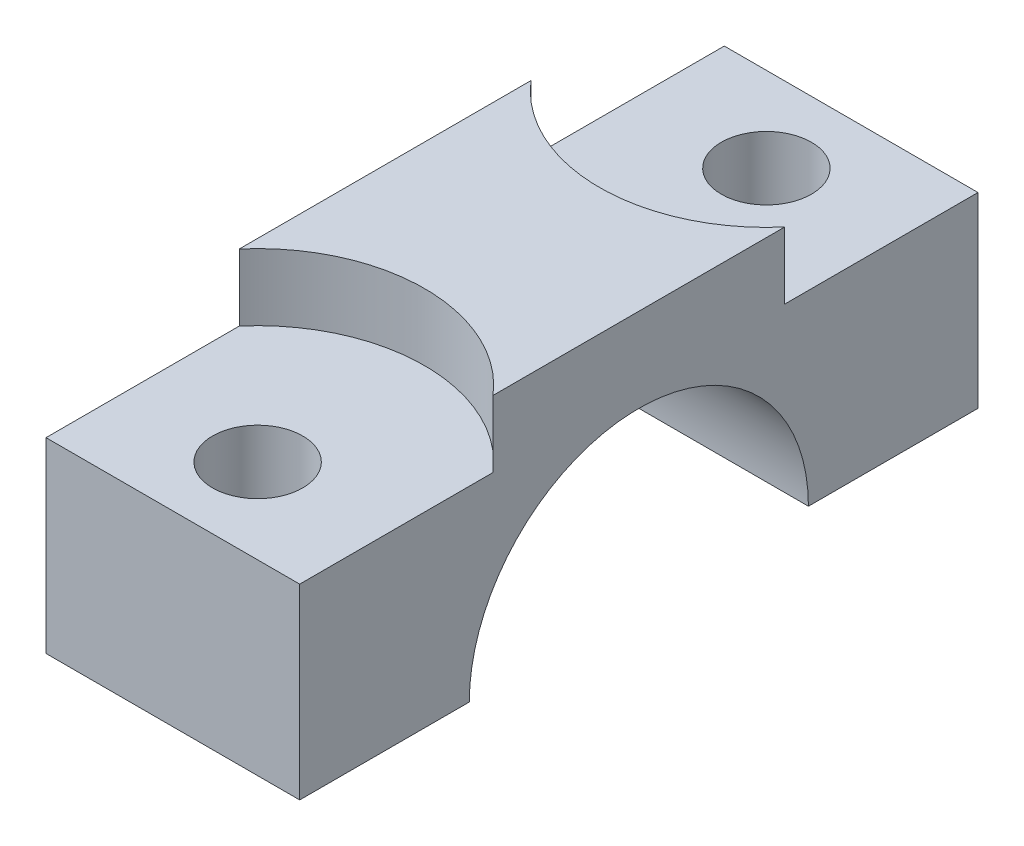
ISO-10303-21;
HEADER;
FILE_DESCRIPTION(('STEP AP214'),'2;1');
FILE_NAME('part.step','',(''),(''),'','','');
FILE_SCHEMA(('AUTOMOTIVE_DESIGN { 1 0 10303 214 1 1 1 1 }'));
ENDSEC;
DATA;
#1=APPLICATION_CONTEXT('core data for automotive mechanical design processes');
#2=APPLICATION_PROTOCOL_DEFINITION('international standard','automotive_design',2000,#1);
#3=PRODUCT_CONTEXT('',#1,'mechanical');
#4=PRODUCT('Part','Part','',(#3));
#5=PRODUCT_RELATED_PRODUCT_CATEGORY('part','',(#4));
#6=PRODUCT_DEFINITION_FORMATION('','',#4);
#7=PRODUCT_DEFINITION_CONTEXT('part definition',#1,'design');
#8=PRODUCT_DEFINITION('design','',#6,#7);
#9=PRODUCT_DEFINITION_SHAPE('','',#8);
#10=(LENGTH_UNIT() NAMED_UNIT(*) SI_UNIT(.MILLI.,.METRE.));
#11=(NAMED_UNIT(*) PLANE_ANGLE_UNIT() SI_UNIT($,.RADIAN.));
#12=(NAMED_UNIT(*) SI_UNIT($,.STERADIAN.) SOLID_ANGLE_UNIT());
#13=UNCERTAINTY_MEASURE_WITH_UNIT(LENGTH_MEASURE(1.E-05),#10,'distance_accuracy_value','');
#14=(GEOMETRIC_REPRESENTATION_CONTEXT(3) GLOBAL_UNCERTAINTY_ASSIGNED_CONTEXT((#13)) GLOBAL_UNIT_ASSIGNED_CONTEXT((#10,
#11,#12)) REPRESENTATION_CONTEXT('',''));
#15=CARTESIAN_POINT('',(0.,0.,0.));
#16=DIRECTION('',(0.,0.,1.));
#17=DIRECTION('',(1.,0.,0.));
#18=AXIS2_PLACEMENT_3D('',#15,#16,#17);
#19=CARTESIAN_POINT('',(9.5,19.,25.4));
#20=DIRECTION('',(0.,-1.,0.));
#21=DIRECTION('',(0.,0.,-1.));
#22=AXIS2_PLACEMENT_3D('',#19,#20,#21);
#23=PLANE('',#22);
#24=CARTESIAN_POINT('',(0.,19.,-19.05));
#25=DIRECTION('',(0.,1.,0.));
#26=DIRECTION('',(0.,0.,1.));
#27=AXIS2_PLACEMENT_3D('',#24,#25,#26);
#28=CIRCLE('',#27,12.5);
#29=CARTESIAN_POINT('',(-9.5,19.,-10.925961595364));
#30=VERTEX_POINT('',#29);
#31=CARTESIAN_POINT('',(9.5,19.,-10.925961595364));
#32=VERTEX_POINT('',#31);
#33=EDGE_CURVE('E118',#30,#32,#28,.T.);
#34=ORIENTED_EDGE('',*,*,#33,.F.);
#35=DIRECTION('',(0.,0.,1.));
#36=VECTOR('',#35,1.);
#37=CARTESIAN_POINT('',(-9.5,19.,25.4));
#38=LINE('',#37,#36);
#39=CARTESIAN_POINT('',(-9.5,19.,10.925961595364));
#40=VERTEX_POINT('',#39);
#41=EDGE_CURVE('E171',#30,#40,#38,.T.);
#42=ORIENTED_EDGE('',*,*,#41,.T.);
#43=CARTESIAN_POINT('',(0.,19.,19.05));
#44=DIRECTION('',(0.,1.,0.));
#45=DIRECTION('',(0.,0.,1.));
#46=AXIS2_PLACEMENT_3D('',#43,#44,#45);
#47=CIRCLE('',#46,12.5);
#48=CARTESIAN_POINT('',(9.5,19.,10.925961595364));
#49=VERTEX_POINT('',#48);
#50=EDGE_CURVE('E140',#49,#40,#47,.T.);
#51=ORIENTED_EDGE('',*,*,#50,.F.);
#52=DIRECTION('',(0.,0.,1.));
#53=VECTOR('',#52,1.);
#54=CARTESIAN_POINT('',(9.5,19.,25.4));
#55=LINE('',#54,#53);
#56=EDGE_CURVE('E133',#32,#49,#55,.T.);
#57=ORIENTED_EDGE('',*,*,#56,.F.);
#58=EDGE_LOOP('',(#34,#42,#51,#57));
#59=FACE_BOUND('',#58,.T.);
#60=ADVANCED_FACE('F42',(#59),#23,.F.);
#61=CARTESIAN_POINT('',(9.5,19.,25.4));
#62=DIRECTION('',(0.,0.,-1.));
#63=DIRECTION('',(-1.,0.,0.));
#64=AXIS2_PLACEMENT_3D('',#61,#62,#63);
#65=PLANE('',#64);
#66=DIRECTION('',(0.,-1.,0.));
#67=VECTOR('',#66,1.);
#68=CARTESIAN_POINT('',(9.5,19.,25.4));
#69=LINE('',#68,#67);
#70=CARTESIAN_POINT('',(9.5,14.,25.4));
#71=VERTEX_POINT('',#70);
#72=CARTESIAN_POINT('',(9.5,0.,25.4));
#73=VERTEX_POINT('',#72);
#74=EDGE_CURVE('E173',#71,#73,#69,.T.);
#75=ORIENTED_EDGE('',*,*,#74,.F.);
#76=DIRECTION('',(-1.,0.,0.));
#77=VECTOR('',#76,1.);
#78=CARTESIAN_POINT('',(9.5,14.,25.4));
#79=LINE('',#78,#77);
#80=CARTESIAN_POINT('',(-9.5,14.,25.4));
#81=VERTEX_POINT('',#80);
#82=EDGE_CURVE('E158',#71,#81,#79,.T.);
#83=ORIENTED_EDGE('',*,*,#82,.T.);
#84=DIRECTION('',(0.,-1.,0.));
#85=VECTOR('',#84,1.);
#86=CARTESIAN_POINT('',(-9.5,19.,25.4));
#87=LINE('',#86,#85);
#88=CARTESIAN_POINT('',(-9.5,0.,25.4));
#89=VERTEX_POINT('',#88);
#90=EDGE_CURVE('E154',#81,#89,#87,.T.);
#91=ORIENTED_EDGE('',*,*,#90,.T.);
#92=DIRECTION('',(-1.,0.,0.));
#93=VECTOR('',#92,1.);
#94=CARTESIAN_POINT('',(9.5,0.,25.4));
#95=LINE('',#94,#93);
#96=EDGE_CURVE('E182',#73,#89,#95,.T.);
#97=ORIENTED_EDGE('',*,*,#96,.F.);
#98=EDGE_LOOP('',(#75,#83,#91,#97));
#99=FACE_BOUND('',#98,.T.);
#100=ADVANCED_FACE('F44',(#99),#65,.F.);
#101=CARTESIAN_POINT('',(9.5,0.,25.4));
#102=DIRECTION('',(0.,1.,0.));
#103=DIRECTION('',(0.,0.,1.));
#104=AXIS2_PLACEMENT_3D('',#101,#102,#103);
#105=PLANE('',#104);
#106=CARTESIAN_POINT('',(0.,0.,19.05));
#107=DIRECTION('',(0.,1.,0.));
#108=DIRECTION('',(0.,0.,1.));
#109=AXIS2_PLACEMENT_3D('',#106,#107,#108);
#110=CIRCLE('',#109,3.375);
#111=CARTESIAN_POINT('',(0.,0.,22.425));
#112=VERTEX_POINT('',#111);
#113=EDGE_CURVE('E259',#112,#112,#110,.T.);
#114=ORIENTED_EDGE('',*,*,#113,.T.);
#115=EDGE_LOOP('',(#114));
#116=FACE_BOUND('',#115,.T.);
#117=DIRECTION('',(0.,0.,-1.));
#118=VECTOR('',#117,1.);
#119=CARTESIAN_POINT('',(-9.5,0.,25.4));
#120=LINE('',#119,#118);
#121=CARTESIAN_POINT('',(-9.5,0.,12.7));
#122=VERTEX_POINT('',#121);
#123=EDGE_CURVE('E157',#89,#122,#120,.T.);
#124=ORIENTED_EDGE('',*,*,#123,.T.);
#125=DIRECTION('',(-1.,0.,0.));
#126=VECTOR('',#125,1.);
#127=CARTESIAN_POINT('',(9.5,0.,12.7));
#128=LINE('',#127,#126);
#129=CARTESIAN_POINT('',(9.5,0.,12.7));
#130=VERTEX_POINT('',#129);
#131=EDGE_CURVE('E178',#130,#122,#128,.T.);
#132=ORIENTED_EDGE('',*,*,#131,.F.);
#133=DIRECTION('',(0.,0.,-1.));
#134=VECTOR('',#133,1.);
#135=CARTESIAN_POINT('',(9.5,0.,25.4));
#136=LINE('',#135,#134);
#137=EDGE_CURVE('E220',#73,#130,#136,.T.);
#138=ORIENTED_EDGE('',*,*,#137,.F.);
#139=ORIENTED_EDGE('',*,*,#96,.T.);
#140=EDGE_LOOP('',(#124,#132,#138,#139));
#141=FACE_BOUND('',#140,.T.);
#142=ADVANCED_FACE('F219',(#116,#141),#105,.F.);
#143=CARTESIAN_POINT('',(9.5,0.,0.));
#144=DIRECTION('',(-1.,0.,0.));
#145=DIRECTION('',(0.,0.,1.));
#146=AXIS2_PLACEMENT_3D('',#143,#144,#145);
#147=CYLINDRICAL_SURFACE('',#146,12.7);
#148=CARTESIAN_POINT('',(-9.5,0.,0.));
#149=DIRECTION('',(-1.,0.,0.));
#150=DIRECTION('',(0.,0.,1.));
#151=AXIS2_PLACEMENT_3D('',#148,#149,#150);
#152=CIRCLE('',#151,12.7);
#153=CARTESIAN_POINT('',(-9.5,0.,-12.7));
#154=VERTEX_POINT('',#153);
#155=EDGE_CURVE('E161',#122,#154,#152,.T.);
#156=ORIENTED_EDGE('',*,*,#155,.T.);
#157=DIRECTION('',(-1.,0.,0.));
#158=VECTOR('',#157,1.);
#159=CARTESIAN_POINT('',(9.5,0.,-12.7));
#160=LINE('',#159,#158);
#161=CARTESIAN_POINT('',(9.5,0.,-12.7));
#162=VERTEX_POINT('',#161);
#163=EDGE_CURVE('E148',#162,#154,#160,.T.);
#164=ORIENTED_EDGE('',*,*,#163,.F.);
#165=CARTESIAN_POINT('',(9.5,0.,0.));
#166=DIRECTION('',(-1.,0.,0.));
#167=DIRECTION('',(0.,0.,1.));
#168=AXIS2_PLACEMENT_3D('',#165,#166,#167);
#169=CIRCLE('',#168,12.7);
#170=EDGE_CURVE('E223',#130,#162,#169,.T.);
#171=ORIENTED_EDGE('',*,*,#170,.F.);
#172=ORIENTED_EDGE('',*,*,#131,.T.);
#173=EDGE_LOOP('',(#156,#164,#171,#172));
#174=FACE_BOUND('',#173,.T.);
#175=ADVANCED_FACE('F295',(#174),#147,.F.);
#176=CARTESIAN_POINT('',(9.5,0.,-12.7));
#177=DIRECTION('',(0.,1.,0.));
#178=DIRECTION('',(0.,0.,1.));
#179=AXIS2_PLACEMENT_3D('',#176,#177,#178);
#180=PLANE('',#179);
#181=CARTESIAN_POINT('',(0.,0.,-19.05));
#182=DIRECTION('',(0.,1.,0.));
#183=DIRECTION('',(0.,0.,1.));
#184=AXIS2_PLACEMENT_3D('',#181,#182,#183);
#185=CIRCLE('',#184,3.375);
#186=CARTESIAN_POINT('',(0.,0.,-15.675));
#187=VERTEX_POINT('',#186);
#188=EDGE_CURVE('E243',#187,#187,#185,.T.);
#189=ORIENTED_EDGE('',*,*,#188,.T.);
#190=EDGE_LOOP('',(#189));
#191=FACE_BOUND('',#190,.T.);
#192=DIRECTION('',(0.,0.,-1.));
#193=VECTOR('',#192,1.);
#194=CARTESIAN_POINT('',(-9.5,0.,-12.7));
#195=LINE('',#194,#193);
#196=CARTESIAN_POINT('',(-9.5,0.,-25.4));
#197=VERTEX_POINT('',#196);
#198=EDGE_CURVE('E164',#154,#197,#195,.T.);
#199=ORIENTED_EDGE('',*,*,#198,.T.);
#200=DIRECTION('',(-1.,0.,0.));
#201=VECTOR('',#200,1.);
#202=CARTESIAN_POINT('',(9.5,0.,-25.4));
#203=LINE('',#202,#201);
#204=CARTESIAN_POINT('',(9.5,0.,-25.4));
#205=VERTEX_POINT('',#204);
#206=EDGE_CURVE('E142',#205,#197,#203,.T.);
#207=ORIENTED_EDGE('',*,*,#206,.F.);
#208=DIRECTION('',(0.,0.,-1.));
#209=VECTOR('',#208,1.);
#210=CARTESIAN_POINT('',(9.5,0.,-12.7));
#211=LINE('',#210,#209);
#212=EDGE_CURVE('E150',#162,#205,#211,.T.);
#213=ORIENTED_EDGE('',*,*,#212,.F.);
#214=ORIENTED_EDGE('',*,*,#163,.T.);
#215=EDGE_LOOP('',(#199,#207,#213,#214));
#216=FACE_BOUND('',#215,.T.);
#217=ADVANCED_FACE('F235',(#191,#216),#180,.F.);
#218=CARTESIAN_POINT('',(9.5,19.,-25.4));
#219=DIRECTION('',(0.,0.,1.));
#220=DIRECTION('',(1.,0.,0.));
#221=AXIS2_PLACEMENT_3D('',#218,#219,#220);
#222=PLANE('',#221);
#223=DIRECTION('',(0.,1.,0.));
#224=VECTOR('',#223,1.);
#225=CARTESIAN_POINT('',(-9.5,19.,-25.4));
#226=LINE('',#225,#224);
#227=CARTESIAN_POINT('',(-9.5,14.,-25.4));
#228=VERTEX_POINT('',#227);
#229=EDGE_CURVE('E167',#197,#228,#226,.T.);
#230=ORIENTED_EDGE('',*,*,#229,.T.);
#231=DIRECTION('',(1.,0.,0.));
#232=VECTOR('',#231,1.);
#233=CARTESIAN_POINT('',(9.5,14.,-25.4));
#234=LINE('',#233,#232);
#235=CARTESIAN_POINT('',(9.5,14.,-25.4));
#236=VERTEX_POINT('',#235);
#237=EDGE_CURVE('E240',#228,#236,#234,.T.);
#238=ORIENTED_EDGE('',*,*,#237,.T.);
#239=DIRECTION('',(0.,1.,0.));
#240=VECTOR('',#239,1.);
#241=CARTESIAN_POINT('',(9.5,19.,-25.4));
#242=LINE('',#241,#240);
#243=EDGE_CURVE('E143',#205,#236,#242,.T.);
#244=ORIENTED_EDGE('',*,*,#243,.F.);
#245=ORIENTED_EDGE('',*,*,#206,.T.);
#246=EDGE_LOOP('',(#230,#238,#244,#245));
#247=FACE_BOUND('',#246,.T.);
#248=ADVANCED_FACE('F239',(#247),#222,.F.);
#249=CARTESIAN_POINT('',(9.5,0.,0.));
#250=DIRECTION('',(-1.,0.,0.));
#251=DIRECTION('',(0.,0.,1.));
#252=AXIS2_PLACEMENT_3D('',#249,#250,#251);
#253=PLANE('',#252);
#254=ORIENTED_EDGE('',*,*,#243,.T.);
#255=DIRECTION('',(0.,0.,1.));
#256=VECTOR('',#255,1.);
#257=CARTESIAN_POINT('',(9.5,14.,0.));
#258=LINE('',#257,#256);
#259=CARTESIAN_POINT('',(9.5,14.,-10.925961595364));
#260=VERTEX_POINT('',#259);
#261=EDGE_CURVE('E134',#236,#260,#258,.T.);
#262=ORIENTED_EDGE('',*,*,#261,.T.);
#263=DIRECTION('',(0.,1.,0.));
#264=VECTOR('',#263,1.);
#265=CARTESIAN_POINT('',(9.5,19.,-10.925961595364));
#266=LINE('',#265,#264);
#267=EDGE_CURVE('E121',#260,#32,#266,.T.);
#268=ORIENTED_EDGE('',*,*,#267,.T.);
#269=ORIENTED_EDGE('',*,*,#56,.T.);
#270=DIRECTION('',(0.,1.,0.));
#271=VECTOR('',#270,1.);
#272=CARTESIAN_POINT('',(9.5,19.,10.925961595364));
#273=LINE('',#272,#271);
#274=CARTESIAN_POINT('',(9.5,14.,10.925961595364));
#275=VERTEX_POINT('',#274);
#276=EDGE_CURVE('E186',#49,#275,#273,.F.);
#277=ORIENTED_EDGE('',*,*,#276,.T.);
#278=DIRECTION('',(0.,0.,1.));
#279=VECTOR('',#278,1.);
#280=CARTESIAN_POINT('',(9.5,14.,0.));
#281=LINE('',#280,#279);
#282=EDGE_CURVE('E189',#275,#71,#281,.T.);
#283=ORIENTED_EDGE('',*,*,#282,.T.);
#284=ORIENTED_EDGE('',*,*,#74,.T.);
#285=ORIENTED_EDGE('',*,*,#137,.T.);
#286=ORIENTED_EDGE('',*,*,#170,.T.);
#287=ORIENTED_EDGE('',*,*,#212,.T.);
#288=EDGE_LOOP('',(#254,#262,#268,#269,#277,#283,#284,#285,#286,#287));
#289=FACE_BOUND('',#288,.T.);
#290=ADVANCED_FACE('F131',(#289),#253,.F.);
#291=CARTESIAN_POINT('',(-9.5,0.,0.));
#292=DIRECTION('',(-1.,0.,0.));
#293=DIRECTION('',(0.,0.,1.));
#294=AXIS2_PLACEMENT_3D('',#291,#292,#293);
#295=PLANE('',#294);
#296=DIRECTION('',(0.,0.,1.));
#297=VECTOR('',#296,1.);
#298=CARTESIAN_POINT('',(-9.5,14.,0.));
#299=LINE('',#298,#297);
#300=CARTESIAN_POINT('',(-9.5,14.,-10.925961595364));
#301=VERTEX_POINT('',#300);
#302=EDGE_CURVE('E11',#228,#301,#299,.T.);
#303=ORIENTED_EDGE('',*,*,#302,.F.);
#304=ORIENTED_EDGE('',*,*,#229,.F.);
#305=ORIENTED_EDGE('',*,*,#198,.F.);
#306=ORIENTED_EDGE('',*,*,#155,.F.);
#307=ORIENTED_EDGE('',*,*,#123,.F.);
#308=ORIENTED_EDGE('',*,*,#90,.F.);
#309=DIRECTION('',(0.,0.,1.));
#310=VECTOR('',#309,1.);
#311=CARTESIAN_POINT('',(-9.5,14.,0.));
#312=LINE('',#311,#310);
#313=CARTESIAN_POINT('',(-9.5,14.,10.925961595364));
#314=VERTEX_POINT('',#313);
#315=EDGE_CURVE('E136',#314,#81,#312,.T.);
#316=ORIENTED_EDGE('',*,*,#315,.F.);
#317=DIRECTION('',(0.,1.,0.));
#318=VECTOR('',#317,1.);
#319=CARTESIAN_POINT('',(-9.5,19.,10.925961595364));
#320=LINE('',#319,#318);
#321=EDGE_CURVE('E210',#40,#314,#320,.F.);
#322=ORIENTED_EDGE('',*,*,#321,.F.);
#323=ORIENTED_EDGE('',*,*,#41,.F.);
#324=DIRECTION('',(0.,1.,0.));
#325=VECTOR('',#324,1.);
#326=CARTESIAN_POINT('',(-9.5,19.,-10.925961595364));
#327=LINE('',#326,#325);
#328=EDGE_CURVE('E51',#301,#30,#327,.T.);
#329=ORIENTED_EDGE('',*,*,#328,.F.);
#330=EDGE_LOOP('',(#303,#304,#305,#306,#307,#308,#316,#322,#323,#329));
#331=FACE_BOUND('',#330,.T.);
#332=ADVANCED_FACE('F213',(#331),#295,.T.);
#333=CARTESIAN_POINT('',(0.,19.,19.05));
#334=DIRECTION('',(0.,1.,0.));
#335=DIRECTION('',(0.,0.,1.));
#336=AXIS2_PLACEMENT_3D('',#333,#334,#335);
#337=CYLINDRICAL_SURFACE('',#336,3.375);
#338=ORIENTED_EDGE('',*,*,#113,.F.);
#339=EDGE_LOOP('',(#338));
#340=FACE_BOUND('',#339,.T.);
#341=CARTESIAN_POINT('',(0.,14.,19.05));
#342=DIRECTION('',(0.,1.,0.));
#343=DIRECTION('',(0.,0.,1.));
#344=AXIS2_PLACEMENT_3D('',#341,#342,#343);
#345=CIRCLE('',#344,3.37500000000001);
#346=CARTESIAN_POINT('',(0.,14.,22.425));
#347=VERTEX_POINT('',#346);
#348=EDGE_CURVE('E255',#347,#347,#345,.T.);
#349=ORIENTED_EDGE('',*,*,#348,.T.);
#350=EDGE_LOOP('',(#349));
#351=FACE_BOUND('',#350,.T.);
#352=ADVANCED_FACE('F305',(#340,#351),#337,.F.);
#353=CARTESIAN_POINT('',(3.37500000000001,14.,19.05));
#354=DIRECTION('',(0.,-1.,0.));
#355=DIRECTION('',(0.,0.,-1.));
#356=AXIS2_PLACEMENT_3D('',#353,#354,#355);
#357=PLANE('',#356);
#358=ORIENTED_EDGE('',*,*,#315,.T.);
#359=ORIENTED_EDGE('',*,*,#82,.F.);
#360=ORIENTED_EDGE('',*,*,#282,.F.);
#361=CARTESIAN_POINT('',(0.,14.,19.05));
#362=DIRECTION('',(0.,1.,0.));
#363=DIRECTION('',(0.,0.,1.));
#364=AXIS2_PLACEMENT_3D('',#361,#362,#363);
#365=CIRCLE('',#364,12.5);
#366=EDGE_CURVE('E65',#275,#314,#365,.T.);
#367=ORIENTED_EDGE('',*,*,#366,.T.);
#368=EDGE_LOOP('',(#358,#359,#360,#367));
#369=FACE_BOUND('',#368,.T.);
#370=ORIENTED_EDGE('',*,*,#348,.F.);
#371=EDGE_LOOP('',(#370));
#372=FACE_BOUND('',#371,.T.);
#373=ADVANCED_FACE('F200',(#369,#372),#357,.F.);
#374=CARTESIAN_POINT('',(0.,19.,19.05));
#375=DIRECTION('',(0.,1.,0.));
#376=DIRECTION('',(0.,0.,1.));
#377=AXIS2_PLACEMENT_3D('',#374,#375,#376);
#378=CYLINDRICAL_SURFACE('',#377,12.5);
#379=ORIENTED_EDGE('',*,*,#321,.T.);
#380=ORIENTED_EDGE('',*,*,#366,.F.);
#381=ORIENTED_EDGE('',*,*,#276,.F.);
#382=ORIENTED_EDGE('',*,*,#50,.T.);
#383=EDGE_LOOP('',(#379,#380,#381,#382));
#384=FACE_BOUND('',#383,.T.);
#385=ADVANCED_FACE('F264',(#384),#378,.F.);
#386=CARTESIAN_POINT('',(3.37500000000001,14.,-19.05));
#387=DIRECTION('',(0.,-1.,0.));
#388=DIRECTION('',(0.,0.,-1.));
#389=AXIS2_PLACEMENT_3D('',#386,#387,#388);
#390=PLANE('',#389);
#391=CARTESIAN_POINT('',(0.,14.,-19.05));
#392=DIRECTION('',(0.,1.,0.));
#393=DIRECTION('',(0.,0.,1.));
#394=AXIS2_PLACEMENT_3D('',#391,#392,#393);
#395=CIRCLE('',#394,3.37500000000001);
#396=CARTESIAN_POINT('',(0.,14.,-15.675));
#397=VERTEX_POINT('',#396);
#398=EDGE_CURVE('E249',#397,#397,#395,.T.);
#399=ORIENTED_EDGE('',*,*,#398,.F.);
#400=EDGE_LOOP('',(#399));
#401=FACE_BOUND('',#400,.T.);
#402=ORIENTED_EDGE('',*,*,#237,.F.);
#403=ORIENTED_EDGE('',*,*,#302,.T.);
#404=CARTESIAN_POINT('',(0.,14.,-19.05));
#405=DIRECTION('',(0.,1.,0.));
#406=DIRECTION('',(0.,0.,1.));
#407=AXIS2_PLACEMENT_3D('',#404,#405,#406);
#408=CIRCLE('',#407,12.5);
#409=EDGE_CURVE('E58',#301,#260,#408,.T.);
#410=ORIENTED_EDGE('',*,*,#409,.T.);
#411=ORIENTED_EDGE('',*,*,#261,.F.);
#412=EDGE_LOOP('',(#402,#403,#410,#411));
#413=FACE_BOUND('',#412,.T.);
#414=ADVANCED_FACE('F265',(#401,#413),#390,.F.);
#415=CARTESIAN_POINT('',(0.,19.,-19.05));
#416=DIRECTION('',(0.,1.,0.));
#417=DIRECTION('',(0.,0.,1.));
#418=AXIS2_PLACEMENT_3D('',#415,#416,#417);
#419=CYLINDRICAL_SURFACE('',#418,12.5);
#420=ORIENTED_EDGE('',*,*,#409,.F.);
#421=ORIENTED_EDGE('',*,*,#328,.T.);
#422=ORIENTED_EDGE('',*,*,#33,.T.);
#423=ORIENTED_EDGE('',*,*,#267,.F.);
#424=EDGE_LOOP('',(#420,#421,#422,#423));
#425=FACE_BOUND('',#424,.T.);
#426=ADVANCED_FACE('F120',(#425),#419,.F.);
#427=CARTESIAN_POINT('',(0.,19.,-19.05));
#428=DIRECTION('',(0.,1.,0.));
#429=DIRECTION('',(0.,0.,1.));
#430=AXIS2_PLACEMENT_3D('',#427,#428,#429);
#431=CYLINDRICAL_SURFACE('',#430,3.375);
#432=ORIENTED_EDGE('',*,*,#188,.F.);
#433=EDGE_LOOP('',(#432));
#434=FACE_BOUND('',#433,.T.);
#435=ORIENTED_EDGE('',*,*,#398,.T.);
#436=EDGE_LOOP('',(#435));
#437=FACE_BOUND('',#436,.T.);
#438=ADVANCED_FACE('F272',(#434,#437),#431,.F.);
#439=CLOSED_SHELL('',(#60,#100,#142,#175,#217,#248,#290,#332,#352,#373,#385,#414,#426,#438));
#440=MANIFOLD_SOLID_BREP('B2',#439);
#441=ADVANCED_BREP_SHAPE_REPRESENTATION('',(#18,#440),#14);
#442=SHAPE_DEFINITION_REPRESENTATION(#9,#441);
ENDSEC;
END-ISO-10303-21;
